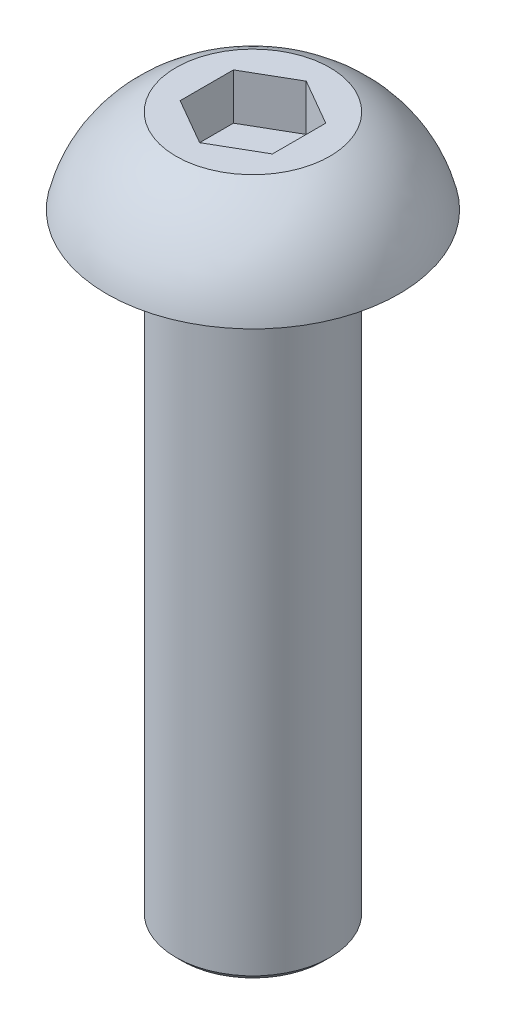
ISO-10303-21;
HEADER;
FILE_DESCRIPTION(('STEP AP214'),'2;1');
FILE_NAME('part.step','',(''),(''),'','','');
FILE_SCHEMA(('AUTOMOTIVE_DESIGN { 1 0 10303 214 1 1 1 1 }'));
ENDSEC;
DATA;
#1=APPLICATION_CONTEXT('core data for automotive mechanical design processes');
#2=APPLICATION_PROTOCOL_DEFINITION('international standard','automotive_design',2000,#1);
#3=PRODUCT_CONTEXT('',#1,'mechanical');
#4=PRODUCT('Part','Part','',(#3));
#5=PRODUCT_RELATED_PRODUCT_CATEGORY('part','',(#4));
#6=PRODUCT_DEFINITION_FORMATION('','',#4);
#7=PRODUCT_DEFINITION_CONTEXT('part definition',#1,'design');
#8=PRODUCT_DEFINITION('design','',#6,#7);
#9=PRODUCT_DEFINITION_SHAPE('','',#8);
#10=(LENGTH_UNIT() NAMED_UNIT(*) SI_UNIT(.MILLI.,.METRE.));
#11=(NAMED_UNIT(*) PLANE_ANGLE_UNIT() SI_UNIT($,.RADIAN.));
#12=(NAMED_UNIT(*) SI_UNIT($,.STERADIAN.) SOLID_ANGLE_UNIT());
#13=UNCERTAINTY_MEASURE_WITH_UNIT(LENGTH_MEASURE(1.E-05),#10,'distance_accuracy_value','');
#14=(GEOMETRIC_REPRESENTATION_CONTEXT(3) GLOBAL_UNCERTAINTY_ASSIGNED_CONTEXT((#13)) GLOBAL_UNIT_ASSIGNED_CONTEXT((#10,
#11,#12)) REPRESENTATION_CONTEXT('',''));
#15=CARTESIAN_POINT('',(0.,0.,0.));
#16=DIRECTION('',(0.,0.,1.));
#17=DIRECTION('',(1.,0.,0.));
#18=AXIS2_PLACEMENT_3D('',#15,#16,#17);
#19=CARTESIAN_POINT('',(0.,2.75,0.));
#20=DIRECTION('',(0.,1.,0.));
#21=DIRECTION('',(0.,0.,1.));
#22=AXIS2_PLACEMENT_3D('',#19,#20,#21);
#23=PLANE('',#22);
#24=DIRECTION('',(-0.866025403784439,0.,0.5));
#25=VECTOR('',#24,1.);
#26=CARTESIAN_POINT('',(0.,2.75,-1.73205080756887));
#27=LINE('',#26,#25);
#28=CARTESIAN_POINT('',(0.,2.75,-1.73205080756887));
#29=VERTEX_POINT('',#28);
#30=CARTESIAN_POINT('',(-1.5,2.75,-0.866025403784439));
#31=VERTEX_POINT('',#30);
#32=EDGE_CURVE('E32',#29,#31,#27,.T.);
#33=ORIENTED_EDGE('',*,*,#32,.F.);
#34=DIRECTION('',(-0.866025403784439,0.,-0.5));
#35=VECTOR('',#34,1.);
#36=CARTESIAN_POINT('',(1.5,2.75,-0.866025403784439));
#37=LINE('',#36,#35);
#38=CARTESIAN_POINT('',(1.5,2.75,-0.866025403784439));
#39=VERTEX_POINT('',#38);
#40=EDGE_CURVE('E126',#39,#29,#37,.T.);
#41=ORIENTED_EDGE('',*,*,#40,.F.);
#42=DIRECTION('',(0.,0.,-1.));
#43=VECTOR('',#42,1.);
#44=CARTESIAN_POINT('',(1.5,2.75,0.866025403784438));
#45=LINE('',#44,#43);
#46=CARTESIAN_POINT('',(1.5,2.75,0.866025403784438));
#47=VERTEX_POINT('',#46);
#48=EDGE_CURVE('E123',#47,#39,#45,.T.);
#49=ORIENTED_EDGE('',*,*,#48,.F.);
#50=DIRECTION('',(0.866025403784439,0.,-0.5));
#51=VECTOR('',#50,1.);
#52=CARTESIAN_POINT('',(0.,2.75,1.73205080756887));
#53=LINE('',#52,#51);
#54=CARTESIAN_POINT('',(0.,2.75,1.73205080756887));
#55=VERTEX_POINT('',#54);
#56=EDGE_CURVE('E80',#55,#47,#53,.T.);
#57=ORIENTED_EDGE('',*,*,#56,.F.);
#58=DIRECTION('',(0.866025403784439,0.,0.5));
#59=VECTOR('',#58,1.);
#60=CARTESIAN_POINT('',(-1.5,2.75,0.866025403784439));
#61=LINE('',#60,#59);
#62=CARTESIAN_POINT('',(-1.5,2.75,0.866025403784439));
#63=VERTEX_POINT('',#62);
#64=EDGE_CURVE('E117',#63,#55,#61,.T.);
#65=ORIENTED_EDGE('',*,*,#64,.F.);
#66=DIRECTION('',(0.,0.,1.));
#67=VECTOR('',#66,1.);
#68=CARTESIAN_POINT('',(-1.5,2.75,-0.866025403784439));
#69=LINE('',#68,#67);
#70=EDGE_CURVE('E113',#31,#63,#69,.T.);
#71=ORIENTED_EDGE('',*,*,#70,.F.);
#72=EDGE_LOOP('',(#33,#41,#49,#57,#65,#71));
#73=FACE_BOUND('',#72,.T.);
#74=CARTESIAN_POINT('',(0.,2.75,0.));
#75=DIRECTION('',(0.,1.,0.));
#76=DIRECTION('',(0.,0.,1.));
#77=AXIS2_PLACEMENT_3D('',#74,#75,#76);
#78=CIRCLE('',#77,2.5);
#79=CARTESIAN_POINT('',(0.,2.75,2.5));
#80=VERTEX_POINT('',#79);
#81=EDGE_CURVE('E149',#80,#80,#78,.T.);
#82=ORIENTED_EDGE('',*,*,#81,.T.);
#83=EDGE_LOOP('',(#82));
#84=FACE_BOUND('',#83,.T.);
#85=ADVANCED_FACE('F16',(#73,#84),#23,.T.);
#86=CARTESIAN_POINT('',(0.,-0.894408862271936,0.));
#87=DIRECTION('',(0.,1.,0.));
#88=DIRECTION('',(0.,0.,1.));
#89=AXIS2_PLACEMENT_3D('',#86,#87,#88);
#90=DEGENERATE_TOROIDAL_SURFACE('',#89,0.851278057223178,4.,.T.);
#91=CARTESIAN_POINT('',(0.,0.,0.));
#92=DIRECTION('',(0.,1.,0.));
#93=DIRECTION('',(0.,0.,1.));
#94=AXIS2_PLACEMENT_3D('',#91,#92,#93);
#95=CIRCLE('',#94,4.75);
#96=CARTESIAN_POINT('',(0.,0.,4.75));
#97=VERTEX_POINT('',#96);
#98=EDGE_CURVE('E145',#97,#97,#95,.T.);
#99=ORIENTED_EDGE('',*,*,#98,.T.);
#100=EDGE_LOOP('',(#99));
#101=FACE_BOUND('',#100,.T.);
#102=ORIENTED_EDGE('',*,*,#81,.F.);
#103=EDGE_LOOP('',(#102));
#104=FACE_BOUND('',#103,.T.);
#105=ADVANCED_FACE('F170',(#101,#104),#90,.T.);
#106=CARTESIAN_POINT('',(-2.5,0.,0.));
#107=DIRECTION('',(0.,-1.,0.));
#108=DIRECTION('',(0.,0.,-1.));
#109=AXIS2_PLACEMENT_3D('',#106,#107,#108);
#110=PLANE('',#109);
#111=CARTESIAN_POINT('',(0.,0.,0.));
#112=DIRECTION('',(0.,1.,0.));
#113=DIRECTION('',(0.,0.,1.));
#114=AXIS2_PLACEMENT_3D('',#111,#112,#113);
#115=CIRCLE('',#114,2.5);
#116=CARTESIAN_POINT('',(0.,0.,2.5));
#117=VERTEX_POINT('',#116);
#118=EDGE_CURVE('E132',#117,#117,#115,.T.);
#119=ORIENTED_EDGE('',*,*,#118,.T.);
#120=EDGE_LOOP('',(#119));
#121=FACE_BOUND('',#120,.T.);
#122=ORIENTED_EDGE('',*,*,#98,.F.);
#123=EDGE_LOOP('',(#122));
#124=FACE_BOUND('',#123,.T.);
#125=ADVANCED_FACE('F176',(#121,#124),#110,.T.);
#126=CARTESIAN_POINT('',(0.,60.1595545799248,0.));
#127=DIRECTION('',(0.,1.,0.));
#128=DIRECTION('',(0.,0.,1.));
#129=AXIS2_PLACEMENT_3D('',#126,#127,#128);
#130=CYLINDRICAL_SURFACE('',#129,2.5);
#131=CARTESIAN_POINT('',(0.,-19.8,0.));
#132=DIRECTION('',(0.,-1.,0.));
#133=DIRECTION('',(0.,0.,-1.));
#134=AXIS2_PLACEMENT_3D('',#131,#132,#133);
#135=CIRCLE('',#134,2.5);
#136=CARTESIAN_POINT('',(0.,-19.8,-2.5));
#137=VERTEX_POINT('',#136);
#138=EDGE_CURVE('E25',#137,#137,#135,.F.);
#139=ORIENTED_EDGE('',*,*,#138,.T.);
#140=EDGE_LOOP('',(#139));
#141=FACE_BOUND('',#140,.T.);
#142=ORIENTED_EDGE('',*,*,#118,.F.);
#143=EDGE_LOOP('',(#142));
#144=FACE_BOUND('',#143,.T.);
#145=ADVANCED_FACE('F156',(#141,#144),#130,.T.);
#146=CARTESIAN_POINT('',(0.,-20.,0.));
#147=DIRECTION('',(0.,-1.,0.));
#148=DIRECTION('',(0.,0.,-1.));
#149=AXIS2_PLACEMENT_3D('',#146,#147,#148);
#150=PLANE('',#149);
#151=CARTESIAN_POINT('',(0.,-20.,0.));
#152=DIRECTION('',(0.,-1.,0.));
#153=DIRECTION('',(0.,0.,-1.));
#154=AXIS2_PLACEMENT_3D('',#151,#152,#153);
#155=CIRCLE('',#154,2.3);
#156=CARTESIAN_POINT('',(0.,-20.,-2.3));
#157=VERTEX_POINT('',#156);
#158=EDGE_CURVE('E11',#157,#157,#155,.T.);
#159=ORIENTED_EDGE('',*,*,#158,.T.);
#160=EDGE_LOOP('',(#159));
#161=FACE_BOUND('',#160,.T.);
#162=ADVANCED_FACE('F186',(#161),#150,.T.);
#163=CARTESIAN_POINT('',(0.,1.25,-1.73205080756887));
#164=DIRECTION('',(-0.5,0.,-0.866025403784439));
#165=DIRECTION('',(-0.866025403784439,0.,0.5));
#166=AXIS2_PLACEMENT_3D('',#163,#164,#165);
#167=PLANE('',#166);
#168=ORIENTED_EDGE('',*,*,#32,.T.);
#169=DIRECTION('',(0.,1.,0.));
#170=VECTOR('',#169,1.);
#171=CARTESIAN_POINT('',(-1.5,1.25,-0.866025403784439));
#172=LINE('',#171,#170);
#173=CARTESIAN_POINT('',(-1.5,1.25,-0.866025403784439));
#174=VERTEX_POINT('',#173);
#175=EDGE_CURVE('E62',#174,#31,#172,.T.);
#176=ORIENTED_EDGE('',*,*,#175,.F.);
#177=DIRECTION('',(-0.866025403784439,0.,0.5));
#178=VECTOR('',#177,1.);
#179=CARTESIAN_POINT('',(0.,1.25,-1.73205080756887));
#180=LINE('',#179,#178);
#181=CARTESIAN_POINT('',(0.,1.25,-1.73205080756887));
#182=VERTEX_POINT('',#181);
#183=EDGE_CURVE('E129',#182,#174,#180,.T.);
#184=ORIENTED_EDGE('',*,*,#183,.F.);
#185=DIRECTION('',(0.,1.,0.));
#186=VECTOR('',#185,1.);
#187=CARTESIAN_POINT('',(0.,1.25,-1.73205080756887));
#188=LINE('',#187,#186);
#189=EDGE_CURVE('E40',#182,#29,#188,.T.);
#190=ORIENTED_EDGE('',*,*,#189,.T.);
#191=EDGE_LOOP('',(#168,#176,#184,#190));
#192=FACE_BOUND('',#191,.T.);
#193=ADVANCED_FACE('F189',(#192),#167,.F.);
#194=CARTESIAN_POINT('',(1.5,1.25,-0.866025403784439));
#195=DIRECTION('',(0.5,0.,-0.866025403784439));
#196=DIRECTION('',(-0.866025403784439,0.,-0.5));
#197=AXIS2_PLACEMENT_3D('',#194,#195,#196);
#198=PLANE('',#197);
#199=ORIENTED_EDGE('',*,*,#40,.T.);
#200=ORIENTED_EDGE('',*,*,#189,.F.);
#201=DIRECTION('',(-0.866025403784439,0.,-0.5));
#202=VECTOR('',#201,1.);
#203=CARTESIAN_POINT('',(1.5,1.25,-0.866025403784439));
#204=LINE('',#203,#202);
#205=CARTESIAN_POINT('',(1.5,1.25,-0.866025403784439));
#206=VERTEX_POINT('',#205);
#207=EDGE_CURVE('E94',#206,#182,#204,.T.);
#208=ORIENTED_EDGE('',*,*,#207,.F.);
#209=DIRECTION('',(0.,1.,0.));
#210=VECTOR('',#209,1.);
#211=CARTESIAN_POINT('',(1.5,1.25,-0.866025403784439));
#212=LINE('',#211,#210);
#213=EDGE_CURVE('E85',#206,#39,#212,.T.);
#214=ORIENTED_EDGE('',*,*,#213,.T.);
#215=EDGE_LOOP('',(#199,#200,#208,#214));
#216=FACE_BOUND('',#215,.T.);
#217=ADVANCED_FACE('F193',(#216),#198,.F.);
#218=CARTESIAN_POINT('',(1.5,1.25,0.866025403784438));
#219=DIRECTION('',(1.,0.,0.));
#220=DIRECTION('',(0.,0.,-1.));
#221=AXIS2_PLACEMENT_3D('',#218,#219,#220);
#222=PLANE('',#221);
#223=ORIENTED_EDGE('',*,*,#48,.T.);
#224=ORIENTED_EDGE('',*,*,#213,.F.);
#225=DIRECTION('',(0.,0.,-1.));
#226=VECTOR('',#225,1.);
#227=CARTESIAN_POINT('',(1.5,1.25,0.866025403784438));
#228=LINE('',#227,#226);
#229=CARTESIAN_POINT('',(1.5,1.25,0.866025403784438));
#230=VERTEX_POINT('',#229);
#231=EDGE_CURVE('E89',#230,#206,#228,.T.);
#232=ORIENTED_EDGE('',*,*,#231,.F.);
#233=DIRECTION('',(0.,1.,0.));
#234=VECTOR('',#233,1.);
#235=CARTESIAN_POINT('',(1.5,1.25,0.866025403784438));
#236=LINE('',#235,#234);
#237=EDGE_CURVE('E73',#230,#47,#236,.T.);
#238=ORIENTED_EDGE('',*,*,#237,.T.);
#239=EDGE_LOOP('',(#223,#224,#232,#238));
#240=FACE_BOUND('',#239,.T.);
#241=ADVANCED_FACE('F90',(#240),#222,.F.);
#242=CARTESIAN_POINT('',(0.,1.25,1.73205080756887));
#243=DIRECTION('',(0.5,0.,0.866025403784438));
#244=DIRECTION('',(0.866025403784439,0.,-0.5));
#245=AXIS2_PLACEMENT_3D('',#242,#243,#244);
#246=PLANE('',#245);
#247=ORIENTED_EDGE('',*,*,#56,.T.);
#248=ORIENTED_EDGE('',*,*,#237,.F.);
#249=DIRECTION('',(0.866025403784439,0.,-0.5));
#250=VECTOR('',#249,1.);
#251=CARTESIAN_POINT('',(0.,1.25,1.73205080756887));
#252=LINE('',#251,#250);
#253=CARTESIAN_POINT('',(0.,1.25,1.73205080756887));
#254=VERTEX_POINT('',#253);
#255=EDGE_CURVE('E77',#254,#230,#252,.T.);
#256=ORIENTED_EDGE('',*,*,#255,.F.);
#257=DIRECTION('',(0.,1.,0.));
#258=VECTOR('',#257,1.);
#259=CARTESIAN_POINT('',(0.,1.25,1.73205080756887));
#260=LINE('',#259,#258);
#261=EDGE_CURVE('E86',#254,#55,#260,.T.);
#262=ORIENTED_EDGE('',*,*,#261,.T.);
#263=EDGE_LOOP('',(#247,#248,#256,#262));
#264=FACE_BOUND('',#263,.T.);
#265=ADVANCED_FACE('F75',(#264),#246,.F.);
#266=CARTESIAN_POINT('',(-1.5,1.25,0.866025403784439));
#267=DIRECTION('',(-0.5,0.,0.866025403784439));
#268=DIRECTION('',(0.866025403784439,0.,0.5));
#269=AXIS2_PLACEMENT_3D('',#266,#267,#268);
#270=PLANE('',#269);
#271=ORIENTED_EDGE('',*,*,#64,.T.);
#272=ORIENTED_EDGE('',*,*,#261,.F.);
#273=DIRECTION('',(0.866025403784439,0.,0.5));
#274=VECTOR('',#273,1.);
#275=CARTESIAN_POINT('',(-1.5,1.25,0.866025403784439));
#276=LINE('',#275,#274);
#277=CARTESIAN_POINT('',(-1.5,1.25,0.866025403784439));
#278=VERTEX_POINT('',#277);
#279=EDGE_CURVE('E100',#278,#254,#276,.T.);
#280=ORIENTED_EDGE('',*,*,#279,.F.);
#281=DIRECTION('',(0.,1.,0.));
#282=VECTOR('',#281,1.);
#283=CARTESIAN_POINT('',(-1.5,1.25,0.866025403784439));
#284=LINE('',#283,#282);
#285=EDGE_CURVE('E137',#278,#63,#284,.T.);
#286=ORIENTED_EDGE('',*,*,#285,.T.);
#287=EDGE_LOOP('',(#271,#272,#280,#286));
#288=FACE_BOUND('',#287,.T.);
#289=ADVANCED_FACE('F196',(#288),#270,.F.);
#290=CARTESIAN_POINT('',(-1.5,1.25,-0.866025403784439));
#291=DIRECTION('',(-1.,0.,0.));
#292=DIRECTION('',(0.,0.,1.));
#293=AXIS2_PLACEMENT_3D('',#290,#291,#292);
#294=PLANE('',#293);
#295=ORIENTED_EDGE('',*,*,#70,.T.);
#296=ORIENTED_EDGE('',*,*,#285,.F.);
#297=DIRECTION('',(0.,0.,1.));
#298=VECTOR('',#297,1.);
#299=CARTESIAN_POINT('',(-1.5,1.25,-0.866025403784439));
#300=LINE('',#299,#298);
#301=EDGE_CURVE('E105',#174,#278,#300,.T.);
#302=ORIENTED_EDGE('',*,*,#301,.F.);
#303=ORIENTED_EDGE('',*,*,#175,.T.);
#304=EDGE_LOOP('',(#295,#296,#302,#303));
#305=FACE_BOUND('',#304,.T.);
#306=ADVANCED_FACE('F166',(#305),#294,.F.);
#307=CARTESIAN_POINT('',(0.,1.25,0.));
#308=DIRECTION('',(0.,1.,0.));
#309=DIRECTION('',(0.,0.,1.));
#310=AXIS2_PLACEMENT_3D('',#307,#308,#309);
#311=PLANE('',#310);
#312=ORIENTED_EDGE('',*,*,#183,.T.);
#313=ORIENTED_EDGE('',*,*,#301,.T.);
#314=ORIENTED_EDGE('',*,*,#279,.T.);
#315=ORIENTED_EDGE('',*,*,#255,.T.);
#316=ORIENTED_EDGE('',*,*,#231,.T.);
#317=ORIENTED_EDGE('',*,*,#207,.T.);
#318=EDGE_LOOP('',(#312,#313,#314,#315,#316,#317));
#319=FACE_BOUND('',#318,.T.);
#320=ADVANCED_FACE('F97',(#319),#311,.T.);
#321=CARTESIAN_POINT('',(0.,-19.8,0.));
#322=DIRECTION('',(0.,1.,0.));
#323=DIRECTION('',(0.,0.,1.));
#324=AXIS2_PLACEMENT_3D('',#321,#322,#323);
#325=CONICAL_SURFACE('',#324,2.5,0.785398163397425);
#326=ORIENTED_EDGE('',*,*,#158,.F.);
#327=EDGE_LOOP('',(#326));
#328=FACE_BOUND('',#327,.T.);
#329=ORIENTED_EDGE('',*,*,#138,.F.);
#330=EDGE_LOOP('',(#329));
#331=FACE_BOUND('',#330,.T.);
#332=ADVANCED_FACE('F18',(#328,#331),#325,.T.);
#333=CLOSED_SHELL('',(#85,#105,#125,#145,#162,#193,#217,#241,#265,#289,#306,#320,#332));
#334=MANIFOLD_SOLID_BREP('B1',#333);
#335=ADVANCED_BREP_SHAPE_REPRESENTATION('',(#18,#334),#14);
#336=SHAPE_DEFINITION_REPRESENTATION(#9,#335);
ENDSEC;
END-ISO-10303-21;
